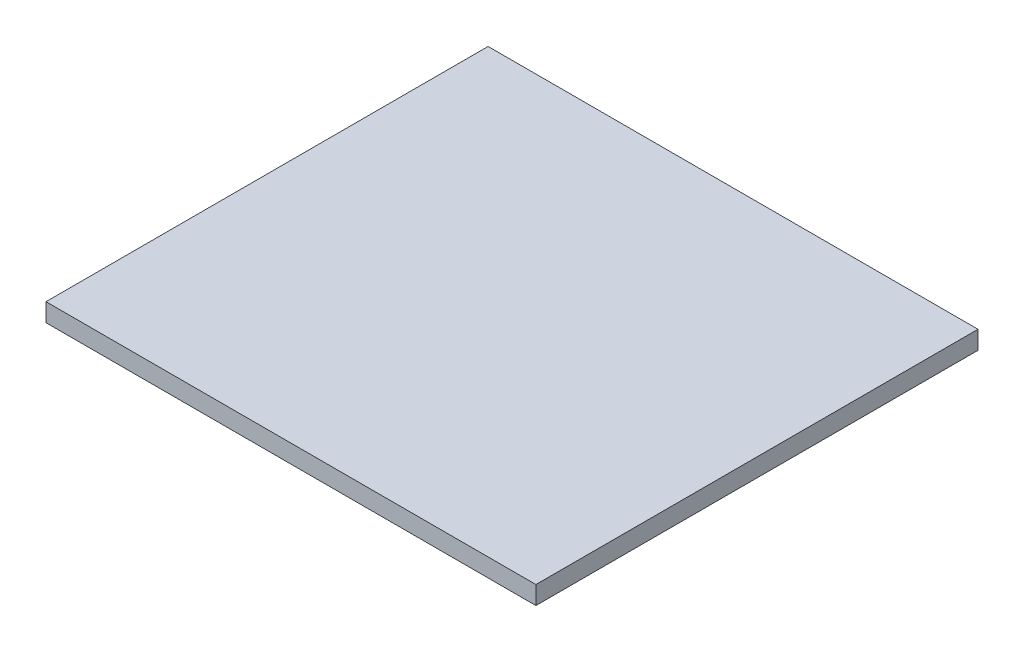
ISO-10303-21;
HEADER;
FILE_DESCRIPTION(('STEP AP214'),'2;1');
FILE_NAME('part.step','',(''),(''),'','','');
FILE_SCHEMA(('AUTOMOTIVE_DESIGN { 1 0 10303 214 1 1 1 1 }'));
ENDSEC;
DATA;
#1=APPLICATION_CONTEXT('core data for automotive mechanical design processes');
#2=APPLICATION_PROTOCOL_DEFINITION('international standard','automotive_design',2000,#1);
#3=PRODUCT_CONTEXT('',#1,'mechanical');
#4=PRODUCT('Part','Part','',(#3));
#5=PRODUCT_RELATED_PRODUCT_CATEGORY('part','',(#4));
#6=PRODUCT_DEFINITION_FORMATION('','',#4);
#7=PRODUCT_DEFINITION_CONTEXT('part definition',#1,'design');
#8=PRODUCT_DEFINITION('design','',#6,#7);
#9=PRODUCT_DEFINITION_SHAPE('','',#8);
#10=(LENGTH_UNIT() NAMED_UNIT(*) SI_UNIT(.MILLI.,.METRE.));
#11=(NAMED_UNIT(*) PLANE_ANGLE_UNIT() SI_UNIT($,.RADIAN.));
#12=(NAMED_UNIT(*) SI_UNIT($,.STERADIAN.) SOLID_ANGLE_UNIT());
#13=UNCERTAINTY_MEASURE_WITH_UNIT(LENGTH_MEASURE(1.E-05),#10,'distance_accuracy_value','');
#14=(GEOMETRIC_REPRESENTATION_CONTEXT(3) GLOBAL_UNCERTAINTY_ASSIGNED_CONTEXT((#13)) GLOBAL_UNIT_ASSIGNED_CONTEXT((#10,
#11,#12)) REPRESENTATION_CONTEXT('',''));
#15=CARTESIAN_POINT('',(0.,0.,0.));
#16=DIRECTION('',(0.,0.,1.));
#17=DIRECTION('',(1.,0.,0.));
#18=AXIS2_PLACEMENT_3D('',#15,#16,#17);
#19=CARTESIAN_POINT('',(9.00000000000001,3.05,0.));
#20=DIRECTION('',(1.,0.,0.));
#21=DIRECTION('',(0.,0.,-1.));
#22=AXIS2_PLACEMENT_3D('',#19,#20,#21);
#23=PLANE('',#22);
#24=DIRECTION('',(0.,0.,1.));
#25=VECTOR('',#24,1.);
#26=CARTESIAN_POINT('',(9.00000000000001,0.,0.));
#27=LINE('',#26,#25);
#28=CARTESIAN_POINT('',(9.00000000000001,0.,-74.));
#29=VERTEX_POINT('',#28);
#30=CARTESIAN_POINT('',(9.00000000000001,0.,0.));
#31=VERTEX_POINT('',#30);
#32=EDGE_CURVE('E95',#29,#31,#27,.T.);
#33=ORIENTED_EDGE('',*,*,#32,.T.);
#34=DIRECTION('',(0.,-1.,0.));
#35=VECTOR('',#34,1.);
#36=CARTESIAN_POINT('',(9.00000000000001,3.05,0.));
#37=LINE('',#36,#35);
#38=CARTESIAN_POINT('',(9.00000000000001,3.05,0.));
#39=VERTEX_POINT('',#38);
#40=EDGE_CURVE('E11',#39,#31,#37,.T.);
#41=ORIENTED_EDGE('',*,*,#40,.F.);
#42=DIRECTION('',(0.,0.,1.));
#43=VECTOR('',#42,1.);
#44=CARTESIAN_POINT('',(9.00000000000001,3.05,0.));
#45=LINE('',#44,#43);
#46=CARTESIAN_POINT('',(9.00000000000001,3.05,-74.));
#47=VERTEX_POINT('',#46);
#48=EDGE_CURVE('E83',#47,#39,#45,.T.);
#49=ORIENTED_EDGE('',*,*,#48,.F.);
#50=DIRECTION('',(0.,-1.,0.));
#51=VECTOR('',#50,1.);
#52=CARTESIAN_POINT('',(9.00000000000001,3.05,-74.));
#53=LINE('',#52,#51);
#54=EDGE_CURVE('E91',#47,#29,#53,.T.);
#55=ORIENTED_EDGE('',*,*,#54,.T.);
#56=EDGE_LOOP('',(#33,#41,#49,#55));
#57=FACE_BOUND('',#56,.T.);
#58=ADVANCED_FACE('F32',(#57),#23,.F.);
#59=CARTESIAN_POINT('',(9.00000000000001,3.05,0.));
#60=DIRECTION('',(0.,0.,-1.));
#61=DIRECTION('',(-1.,0.,0.));
#62=AXIS2_PLACEMENT_3D('',#59,#60,#61);
#63=PLANE('',#62);
#64=DIRECTION('',(1.,0.,0.));
#65=VECTOR('',#64,1.);
#66=CARTESIAN_POINT('',(9.00000000000001,0.,0.));
#67=LINE('',#66,#65);
#68=CARTESIAN_POINT('',(91.,0.,0.));
#69=VERTEX_POINT('',#68);
#70=EDGE_CURVE('E87',#31,#69,#67,.T.);
#71=ORIENTED_EDGE('',*,*,#70,.T.);
#72=DIRECTION('',(0.,-1.,0.));
#73=VECTOR('',#72,1.);
#74=CARTESIAN_POINT('',(91.,3.05,0.));
#75=LINE('',#74,#73);
#76=CARTESIAN_POINT('',(91.,3.05,0.));
#77=VERTEX_POINT('',#76);
#78=EDGE_CURVE('E40',#77,#69,#75,.T.);
#79=ORIENTED_EDGE('',*,*,#78,.F.);
#80=DIRECTION('',(1.,0.,0.));
#81=VECTOR('',#80,1.);
#82=CARTESIAN_POINT('',(9.00000000000001,3.05,0.));
#83=LINE('',#82,#81);
#84=EDGE_CURVE('E78',#39,#77,#83,.T.);
#85=ORIENTED_EDGE('',*,*,#84,.F.);
#86=ORIENTED_EDGE('',*,*,#40,.T.);
#87=EDGE_LOOP('',(#71,#79,#85,#86));
#88=FACE_BOUND('',#87,.T.);
#89=ADVANCED_FACE('F86',(#88),#63,.F.);
#90=CARTESIAN_POINT('',(91.,3.05,0.));
#91=DIRECTION('',(-1.,0.,0.));
#92=DIRECTION('',(0.,0.,1.));
#93=AXIS2_PLACEMENT_3D('',#90,#91,#92);
#94=PLANE('',#93);
#95=DIRECTION('',(0.,0.,-1.));
#96=VECTOR('',#95,1.);
#97=CARTESIAN_POINT('',(91.,0.,0.));
#98=LINE('',#97,#96);
#99=CARTESIAN_POINT('',(91.,0.,-74.));
#100=VERTEX_POINT('',#99);
#101=EDGE_CURVE('E65',#69,#100,#98,.T.);
#102=ORIENTED_EDGE('',*,*,#101,.T.);
#103=DIRECTION('',(0.,-1.,0.));
#104=VECTOR('',#103,1.);
#105=CARTESIAN_POINT('',(91.,3.05,-74.));
#106=LINE('',#105,#104);
#107=CARTESIAN_POINT('',(91.,3.05,-74.));
#108=VERTEX_POINT('',#107);
#109=EDGE_CURVE('E88',#108,#100,#106,.T.);
#110=ORIENTED_EDGE('',*,*,#109,.F.);
#111=DIRECTION('',(0.,0.,-1.));
#112=VECTOR('',#111,1.);
#113=CARTESIAN_POINT('',(91.,3.05,0.));
#114=LINE('',#113,#112);
#115=EDGE_CURVE('E81',#77,#108,#114,.T.);
#116=ORIENTED_EDGE('',*,*,#115,.F.);
#117=ORIENTED_EDGE('',*,*,#78,.T.);
#118=EDGE_LOOP('',(#102,#110,#116,#117));
#119=FACE_BOUND('',#118,.T.);
#120=ADVANCED_FACE('F89',(#119),#94,.F.);
#121=CARTESIAN_POINT('',(9.00000000000001,3.05,-74.));
#122=DIRECTION('',(0.,0.,1.));
#123=DIRECTION('',(1.,0.,0.));
#124=AXIS2_PLACEMENT_3D('',#121,#122,#123);
#125=PLANE('',#124);
#126=DIRECTION('',(-1.,0.,0.));
#127=VECTOR('',#126,1.);
#128=CARTESIAN_POINT('',(9.00000000000001,0.,-74.));
#129=LINE('',#128,#127);
#130=EDGE_CURVE('E71',#100,#29,#129,.T.);
#131=ORIENTED_EDGE('',*,*,#130,.T.);
#132=ORIENTED_EDGE('',*,*,#54,.F.);
#133=DIRECTION('',(-1.,0.,0.));
#134=VECTOR('',#133,1.);
#135=CARTESIAN_POINT('',(9.00000000000001,3.05,-74.));
#136=LINE('',#135,#134);
#137=EDGE_CURVE('E48',#108,#47,#136,.T.);
#138=ORIENTED_EDGE('',*,*,#137,.F.);
#139=ORIENTED_EDGE('',*,*,#109,.T.);
#140=EDGE_LOOP('',(#131,#132,#138,#139));
#141=FACE_BOUND('',#140,.T.);
#142=ADVANCED_FACE('F102',(#141),#125,.F.);
#143=CARTESIAN_POINT('',(0.,3.05,0.));
#144=DIRECTION('',(0.,-1.,0.));
#145=DIRECTION('',(0.,0.,-1.));
#146=AXIS2_PLACEMENT_3D('',#143,#144,#145);
#147=PLANE('',#146);
#148=ORIENTED_EDGE('',*,*,#48,.T.);
#149=ORIENTED_EDGE('',*,*,#84,.T.);
#150=ORIENTED_EDGE('',*,*,#115,.T.);
#151=ORIENTED_EDGE('',*,*,#137,.T.);
#152=EDGE_LOOP('',(#148,#149,#150,#151));
#153=FACE_BOUND('',#152,.T.);
#154=ADVANCED_FACE('F79',(#153),#147,.F.);
#155=CARTESIAN_POINT('',(0.,0.,0.));
#156=DIRECTION('',(0.,-1.,0.));
#157=DIRECTION('',(0.,0.,-1.));
#158=AXIS2_PLACEMENT_3D('',#155,#156,#157);
#159=PLANE('',#158);
#160=ORIENTED_EDGE('',*,*,#32,.F.);
#161=ORIENTED_EDGE('',*,*,#130,.F.);
#162=ORIENTED_EDGE('',*,*,#101,.F.);
#163=ORIENTED_EDGE('',*,*,#70,.F.);
#164=EDGE_LOOP('',(#160,#161,#162,#163));
#165=FACE_BOUND('',#164,.T.);
#166=ADVANCED_FACE('F105',(#165),#159,.T.);
#167=CLOSED_SHELL('',(#58,#89,#120,#142,#154,#166));
#168=MANIFOLD_SOLID_BREP('B2',#167);
#169=ADVANCED_BREP_SHAPE_REPRESENTATION('',(#18,#168),#14);
#170=SHAPE_DEFINITION_REPRESENTATION(#9,#169);
ENDSEC;
END-ISO-10303-21;
